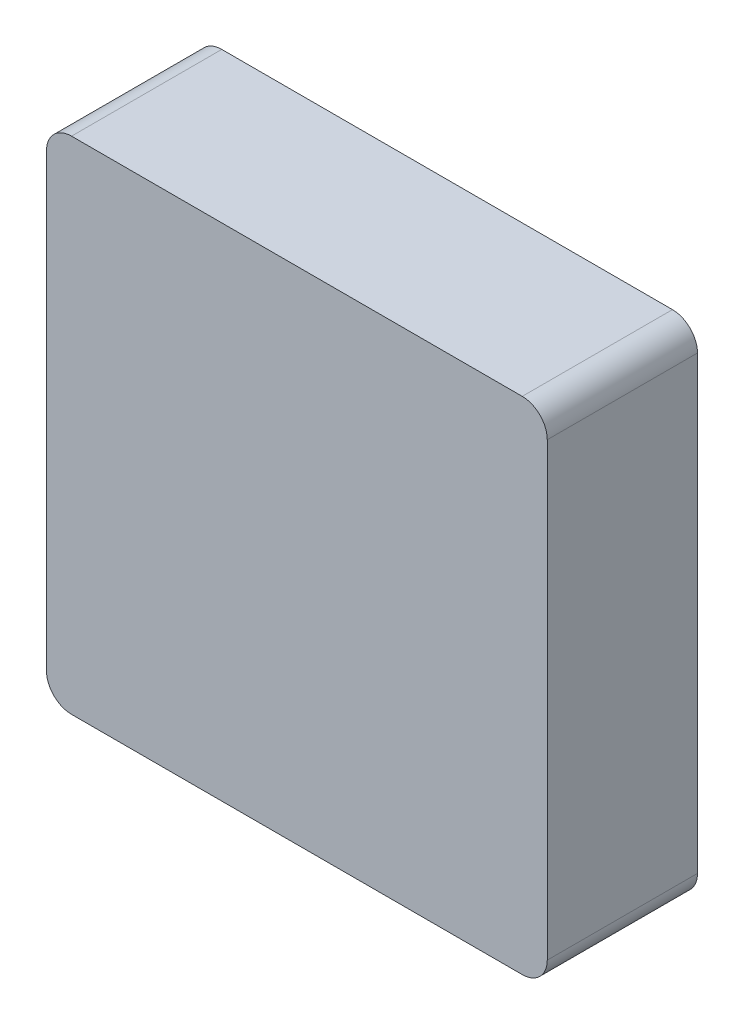
ISO-10303-21;
HEADER;
FILE_DESCRIPTION(('STEP AP214'),'2;1');
FILE_NAME('part.step','',(''),(''),'','','');
FILE_SCHEMA(('AUTOMOTIVE_DESIGN { 1 0 10303 214 1 1 1 1 }'));
ENDSEC;
DATA;
#1=APPLICATION_CONTEXT('core data for automotive mechanical design processes');
#2=APPLICATION_PROTOCOL_DEFINITION('international standard','automotive_design',2000,#1);
#3=PRODUCT_CONTEXT('',#1,'mechanical');
#4=PRODUCT('Part','Part','',(#3));
#5=PRODUCT_RELATED_PRODUCT_CATEGORY('part','',(#4));
#6=PRODUCT_DEFINITION_FORMATION('','',#4);
#7=PRODUCT_DEFINITION_CONTEXT('part definition',#1,'design');
#8=PRODUCT_DEFINITION('design','',#6,#7);
#9=PRODUCT_DEFINITION_SHAPE('','',#8);
#10=(LENGTH_UNIT() NAMED_UNIT(*) SI_UNIT(.MILLI.,.METRE.));
#11=(NAMED_UNIT(*) PLANE_ANGLE_UNIT() SI_UNIT($,.RADIAN.));
#12=(NAMED_UNIT(*) SI_UNIT($,.STERADIAN.) SOLID_ANGLE_UNIT());
#13=UNCERTAINTY_MEASURE_WITH_UNIT(LENGTH_MEASURE(1.E-05),#10,'distance_accuracy_value','');
#14=(GEOMETRIC_REPRESENTATION_CONTEXT(3) GLOBAL_UNCERTAINTY_ASSIGNED_CONTEXT((#13)) GLOBAL_UNIT_ASSIGNED_CONTEXT((#10,
#11,#12)) REPRESENTATION_CONTEXT('',''));
#15=CARTESIAN_POINT('',(0.,0.,0.));
#16=DIRECTION('',(0.,0.,1.));
#17=DIRECTION('',(1.,0.,0.));
#18=AXIS2_PLACEMENT_3D('',#15,#16,#17);
#19=CARTESIAN_POINT('',(-45.,45.,30.));
#20=DIRECTION('',(0.,0.,-1.));
#21=DIRECTION('',(-1.,0.,0.));
#22=AXIS2_PLACEMENT_3D('',#19,#20,#21);
#23=CYLINDRICAL_SURFACE('',#22,5.);
#24=CARTESIAN_POINT('',(-45.,45.,0.));
#25=DIRECTION('',(0.,0.,1.));
#26=DIRECTION('',(-1.,0.,0.));
#27=AXIS2_PLACEMENT_3D('',#24,#25,#26);
#28=CIRCLE('',#27,5.);
#29=CARTESIAN_POINT('',(-45.,50.,0.));
#30=VERTEX_POINT('',#29);
#31=CARTESIAN_POINT('',(-50.,45.,0.));
#32=VERTEX_POINT('',#31);
#33=EDGE_CURVE('E129',#30,#32,#28,.T.);
#34=ORIENTED_EDGE('',*,*,#33,.T.);
#35=DIRECTION('',(0.,0.,-1.));
#36=VECTOR('',#35,1.);
#37=CARTESIAN_POINT('',(-50.,45.,30.));
#38=LINE('',#37,#36);
#39=CARTESIAN_POINT('',(-50.,45.,30.));
#40=VERTEX_POINT('',#39);
#41=EDGE_CURVE('E11',#40,#32,#38,.T.);
#42=ORIENTED_EDGE('',*,*,#41,.F.);
#43=CARTESIAN_POINT('',(-45.,45.,30.));
#44=DIRECTION('',(0.,0.,1.));
#45=DIRECTION('',(-1.,0.,0.));
#46=AXIS2_PLACEMENT_3D('',#43,#44,#45);
#47=CIRCLE('',#46,5.);
#48=CARTESIAN_POINT('',(-45.,50.,30.));
#49=VERTEX_POINT('',#48);
#50=EDGE_CURVE('E143',#49,#40,#47,.T.);
#51=ORIENTED_EDGE('',*,*,#50,.F.);
#52=DIRECTION('',(0.,0.,-1.));
#53=VECTOR('',#52,1.);
#54=CARTESIAN_POINT('',(-45.,50.,30.));
#55=LINE('',#54,#53);
#56=EDGE_CURVE('E125',#49,#30,#55,.T.);
#57=ORIENTED_EDGE('',*,*,#56,.T.);
#58=EDGE_LOOP('',(#34,#42,#51,#57));
#59=FACE_BOUND('',#58,.T.);
#60=ADVANCED_FACE('F33',(#59),#23,.T.);
#61=CARTESIAN_POINT('',(-50.,-45.,30.));
#62=DIRECTION('',(1.,0.,0.));
#63=DIRECTION('',(0.,0.,-1.));
#64=AXIS2_PLACEMENT_3D('',#61,#62,#63);
#65=PLANE('',#64);
#66=DIRECTION('',(0.,-1.,0.));
#67=VECTOR('',#66,1.);
#68=CARTESIAN_POINT('',(-50.,-45.,0.));
#69=LINE('',#68,#67);
#70=CARTESIAN_POINT('',(-50.,-45.,0.));
#71=VERTEX_POINT('',#70);
#72=EDGE_CURVE('E132',#32,#71,#69,.T.);
#73=ORIENTED_EDGE('',*,*,#72,.T.);
#74=DIRECTION('',(0.,0.,-1.));
#75=VECTOR('',#74,1.);
#76=CARTESIAN_POINT('',(-50.,-45.,30.));
#77=LINE('',#76,#75);
#78=CARTESIAN_POINT('',(-50.,-45.,30.));
#79=VERTEX_POINT('',#78);
#80=EDGE_CURVE('E41',#79,#71,#77,.T.);
#81=ORIENTED_EDGE('',*,*,#80,.F.);
#82=DIRECTION('',(0.,-1.,0.));
#83=VECTOR('',#82,1.);
#84=CARTESIAN_POINT('',(-50.,-45.,30.));
#85=LINE('',#84,#83);
#86=EDGE_CURVE('E92',#40,#79,#85,.T.);
#87=ORIENTED_EDGE('',*,*,#86,.F.);
#88=ORIENTED_EDGE('',*,*,#41,.T.);
#89=EDGE_LOOP('',(#73,#81,#87,#88));
#90=FACE_BOUND('',#89,.T.);
#91=ADVANCED_FACE('F178',(#90),#65,.F.);
#92=CARTESIAN_POINT('',(-45.,-45.,30.));
#93=DIRECTION('',(0.,0.,-1.));
#94=DIRECTION('',(-1.,0.,0.));
#95=AXIS2_PLACEMENT_3D('',#92,#93,#94);
#96=CYLINDRICAL_SURFACE('',#95,5.);
#97=CARTESIAN_POINT('',(-45.,-45.,0.));
#98=DIRECTION('',(0.,0.,1.));
#99=DIRECTION('',(-1.,0.,0.));
#100=AXIS2_PLACEMENT_3D('',#97,#98,#99);
#101=CIRCLE('',#100,5.);
#102=CARTESIAN_POINT('',(-45.,-50.,0.));
#103=VERTEX_POINT('',#102);
#104=EDGE_CURVE('E134',#71,#103,#101,.T.);
#105=ORIENTED_EDGE('',*,*,#104,.T.);
#106=DIRECTION('',(0.,0.,-1.));
#107=VECTOR('',#106,1.);
#108=CARTESIAN_POINT('',(-45.,-50.,30.));
#109=LINE('',#108,#107);
#110=CARTESIAN_POINT('',(-45.,-50.,30.));
#111=VERTEX_POINT('',#110);
#112=EDGE_CURVE('E150',#111,#103,#109,.T.);
#113=ORIENTED_EDGE('',*,*,#112,.F.);
#114=CARTESIAN_POINT('',(-45.,-45.,30.));
#115=DIRECTION('',(0.,0.,1.));
#116=DIRECTION('',(-1.,0.,0.));
#117=AXIS2_PLACEMENT_3D('',#114,#115,#116);
#118=CIRCLE('',#117,5.);
#119=EDGE_CURVE('E158',#79,#111,#118,.T.);
#120=ORIENTED_EDGE('',*,*,#119,.F.);
#121=ORIENTED_EDGE('',*,*,#80,.T.);
#122=EDGE_LOOP('',(#105,#113,#120,#121));
#123=FACE_BOUND('',#122,.T.);
#124=ADVANCED_FACE('F156',(#123),#96,.T.);
#125=CARTESIAN_POINT('',(-45.,-50.,30.));
#126=DIRECTION('',(0.,1.,0.));
#127=DIRECTION('',(0.,0.,1.));
#128=AXIS2_PLACEMENT_3D('',#125,#126,#127);
#129=PLANE('',#128);
#130=DIRECTION('',(1.,0.,0.));
#131=VECTOR('',#130,1.);
#132=CARTESIAN_POINT('',(-45.,-50.,0.));
#133=LINE('',#132,#131);
#134=CARTESIAN_POINT('',(45.,-50.,0.));
#135=VERTEX_POINT('',#134);
#136=EDGE_CURVE('E136',#103,#135,#133,.T.);
#137=ORIENTED_EDGE('',*,*,#136,.T.);
#138=DIRECTION('',(0.,0.,-1.));
#139=VECTOR('',#138,1.);
#140=CARTESIAN_POINT('',(45.,-50.,30.));
#141=LINE('',#140,#139);
#142=CARTESIAN_POINT('',(45.,-50.,30.));
#143=VERTEX_POINT('',#142);
#144=EDGE_CURVE('E147',#143,#135,#141,.T.);
#145=ORIENTED_EDGE('',*,*,#144,.F.);
#146=DIRECTION('',(1.,0.,0.));
#147=VECTOR('',#146,1.);
#148=CARTESIAN_POINT('',(-45.,-50.,30.));
#149=LINE('',#148,#147);
#150=EDGE_CURVE('E170',#111,#143,#149,.T.);
#151=ORIENTED_EDGE('',*,*,#150,.F.);
#152=ORIENTED_EDGE('',*,*,#112,.T.);
#153=EDGE_LOOP('',(#137,#145,#151,#152));
#154=FACE_BOUND('',#153,.T.);
#155=ADVANCED_FACE('F166',(#154),#129,.F.);
#156=CARTESIAN_POINT('',(45.,-45.,30.));
#157=DIRECTION('',(0.,0.,-1.));
#158=DIRECTION('',(-1.,0.,0.));
#159=AXIS2_PLACEMENT_3D('',#156,#157,#158);
#160=CYLINDRICAL_SURFACE('',#159,5.);
#161=CARTESIAN_POINT('',(45.,-45.,0.));
#162=DIRECTION('',(0.,0.,1.));
#163=DIRECTION('',(1.,0.,0.));
#164=AXIS2_PLACEMENT_3D('',#161,#162,#163);
#165=CIRCLE('',#164,5.);
#166=CARTESIAN_POINT('',(50.,-45.,0.));
#167=VERTEX_POINT('',#166);
#168=EDGE_CURVE('E138',#135,#167,#165,.T.);
#169=ORIENTED_EDGE('',*,*,#168,.T.);
#170=DIRECTION('',(0.,0.,-1.));
#171=VECTOR('',#170,1.);
#172=CARTESIAN_POINT('',(50.,-45.,30.));
#173=LINE('',#172,#171);
#174=CARTESIAN_POINT('',(50.,-45.,30.));
#175=VERTEX_POINT('',#174);
#176=EDGE_CURVE('E120',#175,#167,#173,.T.);
#177=ORIENTED_EDGE('',*,*,#176,.F.);
#178=CARTESIAN_POINT('',(45.,-45.,30.));
#179=DIRECTION('',(0.,0.,1.));
#180=DIRECTION('',(1.,0.,0.));
#181=AXIS2_PLACEMENT_3D('',#178,#179,#180);
#182=CIRCLE('',#181,5.);
#183=EDGE_CURVE('E111',#143,#175,#182,.T.);
#184=ORIENTED_EDGE('',*,*,#183,.F.);
#185=ORIENTED_EDGE('',*,*,#144,.T.);
#186=EDGE_LOOP('',(#169,#177,#184,#185));
#187=FACE_BOUND('',#186,.T.);
#188=ADVANCED_FACE('F169',(#187),#160,.T.);
#189=CARTESIAN_POINT('',(50.,-45.,30.));
#190=DIRECTION('',(-1.,0.,0.));
#191=DIRECTION('',(0.,0.,1.));
#192=AXIS2_PLACEMENT_3D('',#189,#190,#191);
#193=PLANE('',#192);
#194=DIRECTION('',(0.,1.,0.));
#195=VECTOR('',#194,1.);
#196=CARTESIAN_POINT('',(50.,-45.,0.));
#197=LINE('',#196,#195);
#198=CARTESIAN_POINT('',(50.,45.,0.));
#199=VERTEX_POINT('',#198);
#200=EDGE_CURVE('E119',#167,#199,#197,.T.);
#201=ORIENTED_EDGE('',*,*,#200,.T.);
#202=DIRECTION('',(0.,0.,-1.));
#203=VECTOR('',#202,1.);
#204=CARTESIAN_POINT('',(50.,45.,30.));
#205=LINE('',#204,#203);
#206=CARTESIAN_POINT('',(50.,45.,30.));
#207=VERTEX_POINT('',#206);
#208=EDGE_CURVE('E116',#207,#199,#205,.T.);
#209=ORIENTED_EDGE('',*,*,#208,.F.);
#210=DIRECTION('',(0.,1.,0.));
#211=VECTOR('',#210,1.);
#212=CARTESIAN_POINT('',(50.,-45.,30.));
#213=LINE('',#212,#211);
#214=EDGE_CURVE('E105',#175,#207,#213,.T.);
#215=ORIENTED_EDGE('',*,*,#214,.F.);
#216=ORIENTED_EDGE('',*,*,#176,.T.);
#217=EDGE_LOOP('',(#201,#209,#215,#216));
#218=FACE_BOUND('',#217,.T.);
#219=ADVANCED_FACE('F117',(#218),#193,.F.);
#220=CARTESIAN_POINT('',(45.,45.,30.));
#221=DIRECTION('',(0.,0.,-1.));
#222=DIRECTION('',(-1.,0.,0.));
#223=AXIS2_PLACEMENT_3D('',#220,#221,#222);
#224=CYLINDRICAL_SURFACE('',#223,5.);
#225=CARTESIAN_POINT('',(45.,45.,0.));
#226=DIRECTION('',(0.,0.,1.));
#227=DIRECTION('',(1.,0.,0.));
#228=AXIS2_PLACEMENT_3D('',#225,#226,#227);
#229=CIRCLE('',#228,5.);
#230=CARTESIAN_POINT('',(45.,50.,0.));
#231=VERTEX_POINT('',#230);
#232=EDGE_CURVE('E78',#199,#231,#229,.T.);
#233=ORIENTED_EDGE('',*,*,#232,.T.);
#234=DIRECTION('',(0.,0.,-1.));
#235=VECTOR('',#234,1.);
#236=CARTESIAN_POINT('',(45.,50.,30.));
#237=LINE('',#236,#235);
#238=CARTESIAN_POINT('',(45.,50.,30.));
#239=VERTEX_POINT('',#238);
#240=EDGE_CURVE('E121',#239,#231,#237,.T.);
#241=ORIENTED_EDGE('',*,*,#240,.F.);
#242=CARTESIAN_POINT('',(45.,45.,30.));
#243=DIRECTION('',(0.,0.,1.));
#244=DIRECTION('',(1.,0.,0.));
#245=AXIS2_PLACEMENT_3D('',#242,#243,#244);
#246=CIRCLE('',#245,5.);
#247=EDGE_CURVE('E109',#207,#239,#246,.T.);
#248=ORIENTED_EDGE('',*,*,#247,.F.);
#249=ORIENTED_EDGE('',*,*,#208,.T.);
#250=EDGE_LOOP('',(#233,#241,#248,#249));
#251=FACE_BOUND('',#250,.T.);
#252=ADVANCED_FACE('F123',(#251),#224,.T.);
#253=CARTESIAN_POINT('',(-45.,50.,30.));
#254=DIRECTION('',(0.,-1.,0.));
#255=DIRECTION('',(0.,0.,-1.));
#256=AXIS2_PLACEMENT_3D('',#253,#254,#255);
#257=PLANE('',#256);
#258=DIRECTION('',(-1.,0.,0.));
#259=VECTOR('',#258,1.);
#260=CARTESIAN_POINT('',(-45.,50.,0.));
#261=LINE('',#260,#259);
#262=EDGE_CURVE('E84',#231,#30,#261,.T.);
#263=ORIENTED_EDGE('',*,*,#262,.T.);
#264=ORIENTED_EDGE('',*,*,#56,.F.);
#265=DIRECTION('',(-1.,0.,0.));
#266=VECTOR('',#265,1.);
#267=CARTESIAN_POINT('',(-45.,50.,30.));
#268=LINE('',#267,#266);
#269=EDGE_CURVE('E49',#239,#49,#268,.T.);
#270=ORIENTED_EDGE('',*,*,#269,.F.);
#271=ORIENTED_EDGE('',*,*,#240,.T.);
#272=EDGE_LOOP('',(#263,#264,#270,#271));
#273=FACE_BOUND('',#272,.T.);
#274=ADVANCED_FACE('F194',(#273),#257,.F.);
#275=CARTESIAN_POINT('',(-45.,45.,30.));
#276=DIRECTION('',(0.,0.,-1.));
#277=DIRECTION('',(-1.,0.,0.));
#278=AXIS2_PLACEMENT_3D('',#275,#276,#277);
#279=PLANE('',#278);
#280=ORIENTED_EDGE('',*,*,#50,.T.);
#281=ORIENTED_EDGE('',*,*,#86,.T.);
#282=ORIENTED_EDGE('',*,*,#119,.T.);
#283=ORIENTED_EDGE('',*,*,#150,.T.);
#284=ORIENTED_EDGE('',*,*,#183,.T.);
#285=ORIENTED_EDGE('',*,*,#214,.T.);
#286=ORIENTED_EDGE('',*,*,#247,.T.);
#287=ORIENTED_EDGE('',*,*,#269,.T.);
#288=EDGE_LOOP('',(#280,#281,#282,#283,#284,#285,#286,#287));
#289=FACE_BOUND('',#288,.T.);
#290=ADVANCED_FACE('F107',(#289),#279,.F.);
#291=CARTESIAN_POINT('',(-45.,45.,0.));
#292=DIRECTION('',(0.,0.,-1.));
#293=DIRECTION('',(-1.,0.,0.));
#294=AXIS2_PLACEMENT_3D('',#291,#292,#293);
#295=PLANE('',#294);
#296=ORIENTED_EDGE('',*,*,#33,.F.);
#297=ORIENTED_EDGE('',*,*,#262,.F.);
#298=ORIENTED_EDGE('',*,*,#232,.F.);
#299=ORIENTED_EDGE('',*,*,#200,.F.);
#300=ORIENTED_EDGE('',*,*,#168,.F.);
#301=ORIENTED_EDGE('',*,*,#136,.F.);
#302=ORIENTED_EDGE('',*,*,#104,.F.);
#303=ORIENTED_EDGE('',*,*,#72,.F.);
#304=EDGE_LOOP('',(#296,#297,#298,#299,#300,#301,#302,#303));
#305=FACE_BOUND('',#304,.T.);
#306=ADVANCED_FACE('F162',(#305),#295,.T.);
#307=CLOSED_SHELL('',(#60,#91,#124,#155,#188,#219,#252,#274,#290,#306));
#308=MANIFOLD_SOLID_BREP('B2',#307);
#309=ADVANCED_BREP_SHAPE_REPRESENTATION('',(#18,#308),#14);
#310=SHAPE_DEFINITION_REPRESENTATION(#9,#309);
ENDSEC;
END-ISO-10303-21;
